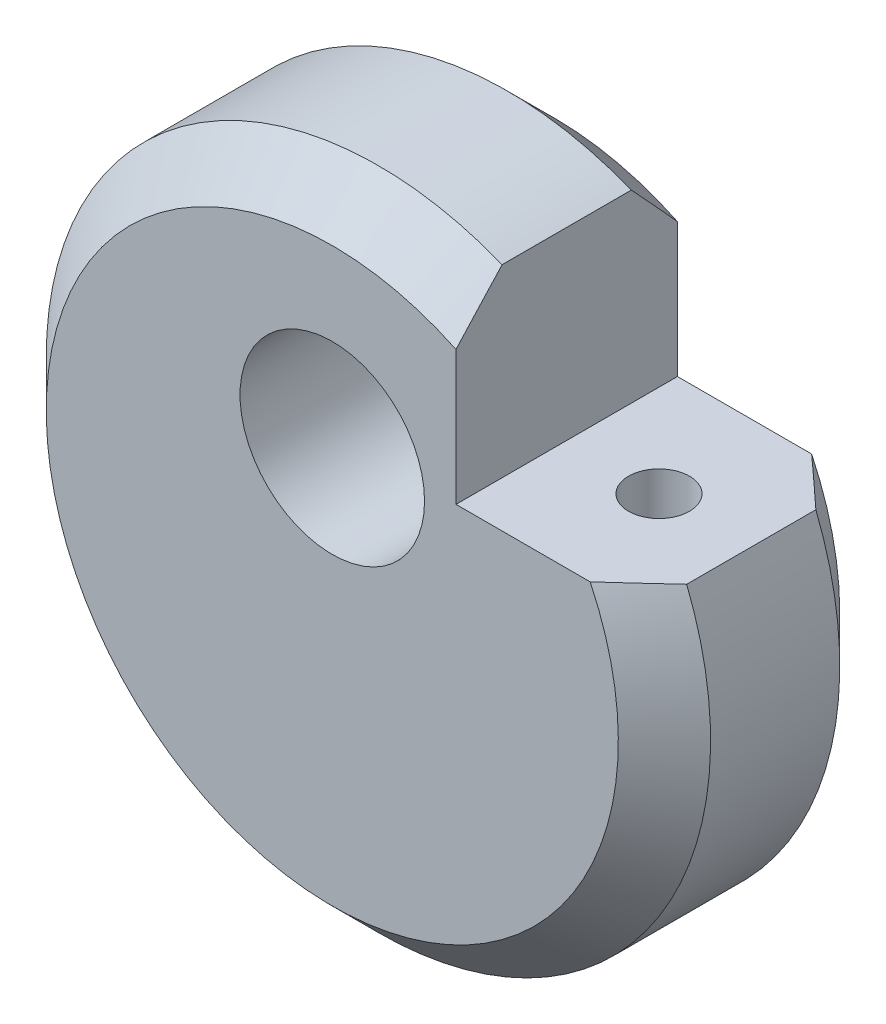
ISO-10303-21;
HEADER;
FILE_DESCRIPTION(('STEP AP214'),'2;1');
FILE_NAME('part.step','',(''),(''),'','','');
FILE_SCHEMA(('AUTOMOTIVE_DESIGN { 1 0 10303 214 1 1 1 1 }'));
ENDSEC;
DATA;
#1=APPLICATION_CONTEXT('core data for automotive mechanical design processes');
#2=APPLICATION_PROTOCOL_DEFINITION('international standard','automotive_design',2000,#1);
#3=PRODUCT_CONTEXT('',#1,'mechanical');
#4=PRODUCT('Part','Part','',(#3));
#5=PRODUCT_RELATED_PRODUCT_CATEGORY('part','',(#4));
#6=PRODUCT_DEFINITION_FORMATION('','',#4);
#7=PRODUCT_DEFINITION_CONTEXT('part definition',#1,'design');
#8=PRODUCT_DEFINITION('design','',#6,#7);
#9=PRODUCT_DEFINITION_SHAPE('','',#8);
#10=(LENGTH_UNIT() NAMED_UNIT(*) SI_UNIT(.MILLI.,.METRE.));
#11=(NAMED_UNIT(*) PLANE_ANGLE_UNIT() SI_UNIT($,.RADIAN.));
#12=(NAMED_UNIT(*) SI_UNIT($,.STERADIAN.) SOLID_ANGLE_UNIT());
#13=UNCERTAINTY_MEASURE_WITH_UNIT(LENGTH_MEASURE(1.E-05),#10,'distance_accuracy_value','');
#14=(GEOMETRIC_REPRESENTATION_CONTEXT(3) GLOBAL_UNCERTAINTY_ASSIGNED_CONTEXT((#13)) GLOBAL_UNIT_ASSIGNED_CONTEXT((#10,
#11,#12)) REPRESENTATION_CONTEXT('',''));
#15=CARTESIAN_POINT('',(0.,0.,0.));
#16=DIRECTION('',(0.,0.,1.));
#17=DIRECTION('',(1.,0.,0.));
#18=AXIS2_PLACEMENT_3D('',#15,#16,#17);
#19=CARTESIAN_POINT('',(0.,0.,-12.));
#20=DIRECTION('',(0.,0.,1.));
#21=DIRECTION('',(1.,0.,0.));
#22=AXIS2_PLACEMENT_3D('',#19,#20,#21);
#23=CYLINDRICAL_SURFACE('',#22,18.);
#24=DIRECTION('',(0.,0.,1.));
#25=VECTOR('',#24,1.);
#26=CARTESIAN_POINT('',(6.70469991071962,16.7046999107196,-17.));
#27=LINE('',#26,#25);
#28=CARTESIAN_POINT('',(6.70469991071962,16.7046999107196,-9.5));
#29=VERTEX_POINT('',#28);
#30=CARTESIAN_POINT('',(6.70469991071962,16.7046999107196,-2.50000000000001));
#31=VERTEX_POINT('',#30);
#32=EDGE_CURVE('E131',#29,#31,#27,.T.);
#33=ORIENTED_EDGE('',*,*,#32,.F.);
#34=CARTESIAN_POINT('',(0.,0.,-9.5));
#35=DIRECTION('',(0.,0.,1.));
#36=DIRECTION('',(1.,0.,0.));
#37=AXIS2_PLACEMENT_3D('',#34,#35,#36);
#38=CIRCLE('',#37,18.);
#39=CARTESIAN_POINT('',(16.7046999107196,6.70469991071962,-9.5));
#40=VERTEX_POINT('',#39);
#41=EDGE_CURVE('E172',#29,#40,#38,.T.);
#42=ORIENTED_EDGE('',*,*,#41,.T.);
#43=DIRECTION('',(0.,0.,1.));
#44=VECTOR('',#43,1.);
#45=CARTESIAN_POINT('',(16.7046999107196,6.70469991071962,-17.));
#46=LINE('',#45,#44);
#47=CARTESIAN_POINT('',(16.7046999107196,6.70469991071962,-2.50000000000001));
#48=VERTEX_POINT('',#47);
#49=EDGE_CURVE('E129',#40,#48,#46,.T.);
#50=ORIENTED_EDGE('',*,*,#49,.T.);
#51=CARTESIAN_POINT('',(0.,0.,-2.50000000000001));
#52=DIRECTION('',(0.,0.,1.));
#53=DIRECTION('',(1.,0.,0.));
#54=AXIS2_PLACEMENT_3D('',#51,#52,#53);
#55=CIRCLE('',#54,18.);
#56=EDGE_CURVE('E151',#48,#31,#55,.F.);
#57=ORIENTED_EDGE('',*,*,#56,.T.);
#58=EDGE_LOOP('',(#33,#42,#50,#57));
#59=FACE_BOUND('',#58,.T.);
#60=ADVANCED_FACE('F49',(#59),#23,.T.);
#61=CARTESIAN_POINT('',(0.,0.,-12.));
#62=DIRECTION('',(0.,0.,1.));
#63=DIRECTION('',(1.,0.,0.));
#64=AXIS2_PLACEMENT_3D('',#61,#62,#63);
#65=PLANE('',#64);
#66=CARTESIAN_POINT('',(0.,6.,-12.));
#67=DIRECTION('',(0.,0.,1.));
#68=DIRECTION('',(1.,0.,0.));
#69=AXIS2_PLACEMENT_3D('',#66,#67,#68);
#70=CIRCLE('',#69,5.);
#71=CARTESIAN_POINT('',(5.,6.,-12.));
#72=VERTEX_POINT('',#71);
#73=EDGE_CURVE('E117',#72,#72,#70,.T.);
#74=ORIENTED_EDGE('',*,*,#73,.T.);
#75=EDGE_LOOP('',(#74));
#76=FACE_BOUND('',#75,.T.);
#77=DIRECTION('',(-1.,0.,0.));
#78=VECTOR('',#77,1.);
#79=CARTESIAN_POINT('',(0.,6.70469991071962,-12.));
#80=LINE('',#79,#78);
#81=CARTESIAN_POINT('',(13.9748702715695,6.70469991071962,-12.));
#82=VERTEX_POINT('',#81);
#83=CARTESIAN_POINT('',(6.70469991071962,6.70469991071962,-12.));
#84=VERTEX_POINT('',#83);
#85=EDGE_CURVE('E138',#82,#84,#80,.T.);
#86=ORIENTED_EDGE('',*,*,#85,.F.);
#87=CARTESIAN_POINT('',(0.,0.,-12.));
#88=DIRECTION('',(0.,0.,1.));
#89=DIRECTION('',(1.,0.,0.));
#90=AXIS2_PLACEMENT_3D('',#87,#88,#89);
#91=CIRCLE('',#90,15.5);
#92=CARTESIAN_POINT('',(6.70469991071962,13.9748702715695,-12.));
#93=VERTEX_POINT('',#92);
#94=EDGE_CURVE('E64',#82,#93,#91,.F.);
#95=ORIENTED_EDGE('',*,*,#94,.T.);
#96=DIRECTION('',(0.,1.,0.));
#97=VECTOR('',#96,1.);
#98=CARTESIAN_POINT('',(6.70469991071962,0.,-12.));
#99=LINE('',#98,#97);
#100=EDGE_CURVE('E136',#84,#93,#99,.T.);
#101=ORIENTED_EDGE('',*,*,#100,.F.);
#102=EDGE_LOOP('',(#86,#95,#101));
#103=FACE_BOUND('',#102,.T.);
#104=ADVANCED_FACE('F188',(#76,#103),#65,.F.);
#105=CARTESIAN_POINT('',(0.,0.,0.));
#106=DIRECTION('',(0.,0.,1.));
#107=DIRECTION('',(1.,0.,0.));
#108=AXIS2_PLACEMENT_3D('',#105,#106,#107);
#109=PLANE('',#108);
#110=CARTESIAN_POINT('',(0.,6.,0.));
#111=DIRECTION('',(0.,0.,1.));
#112=DIRECTION('',(1.,0.,0.));
#113=AXIS2_PLACEMENT_3D('',#110,#111,#112);
#114=CIRCLE('',#113,5.);
#115=CARTESIAN_POINT('',(5.,6.,0.));
#116=VERTEX_POINT('',#115);
#117=EDGE_CURVE('E113',#116,#116,#114,.T.);
#118=ORIENTED_EDGE('',*,*,#117,.F.);
#119=EDGE_LOOP('',(#118));
#120=FACE_BOUND('',#119,.T.);
#121=DIRECTION('',(0.,1.,0.));
#122=VECTOR('',#121,1.);
#123=CARTESIAN_POINT('',(6.70469991071962,6.70469991071962,0.));
#124=LINE('',#123,#122);
#125=CARTESIAN_POINT('',(6.70469991071962,6.70469991071962,0.));
#126=VERTEX_POINT('',#125);
#127=CARTESIAN_POINT('',(6.70469991071962,13.9748702715695,0.));
#128=VERTEX_POINT('',#127);
#129=EDGE_CURVE('E126',#126,#128,#124,.T.);
#130=ORIENTED_EDGE('',*,*,#129,.T.);
#131=CARTESIAN_POINT('',(0.,0.,0.));
#132=DIRECTION('',(0.,0.,1.));
#133=DIRECTION('',(1.,0.,0.));
#134=AXIS2_PLACEMENT_3D('',#131,#132,#133);
#135=CIRCLE('',#134,15.5);
#136=CARTESIAN_POINT('',(13.9748702715695,6.70469991071962,0.));
#137=VERTEX_POINT('',#136);
#138=EDGE_CURVE('E140',#128,#137,#135,.T.);
#139=ORIENTED_EDGE('',*,*,#138,.T.);
#140=DIRECTION('',(-1.,0.,0.));
#141=VECTOR('',#140,1.);
#142=CARTESIAN_POINT('',(16.7046999107196,6.70469991071962,0.));
#143=LINE('',#142,#141);
#144=EDGE_CURVE('E124',#137,#126,#143,.T.);
#145=ORIENTED_EDGE('',*,*,#144,.T.);
#146=EDGE_LOOP('',(#130,#139,#145));
#147=FACE_BOUND('',#146,.T.);
#148=ADVANCED_FACE('F193',(#120,#147),#109,.T.);
#149=CARTESIAN_POINT('',(16.7046999107196,6.70469991071962,-17.));
#150=DIRECTION('',(0.,1.,0.));
#151=DIRECTION('',(-1.,0.,0.));
#152=AXIS2_PLACEMENT_3D('',#149,#150,#151);
#153=PLANE('',#152);
#154=CARTESIAN_POINT('',(11.7046999107196,6.70469991071962,-6.));
#155=DIRECTION('',(0.,1.,0.));
#156=DIRECTION('',(0.,0.,1.));
#157=AXIS2_PLACEMENT_3D('',#154,#155,#156);
#158=CIRCLE('',#157,1.64999999999999);
#159=CARTESIAN_POINT('',(11.7046999107196,6.70469991071962,-4.35000000000001));
#160=VERTEX_POINT('',#159);
#161=EDGE_CURVE('E114',#160,#160,#158,.T.);
#162=ORIENTED_EDGE('',*,*,#161,.F.);
#163=EDGE_LOOP('',(#162));
#164=FACE_BOUND('',#163,.T.);
#165=ORIENTED_EDGE('',*,*,#49,.F.);
#166=CARTESIAN_POINT('',(16.7046999107196,6.70469991071962,-9.5));
#167=CARTESIAN_POINT('',(16.4785916452729,6.70469991071962,-9.70983342483472));
#168=CARTESIAN_POINT('',(16.2521921968646,6.70469991071962,-9.91935360613671));
#169=CARTESIAN_POINT('',(15.7987361529174,6.70469991071962,-10.3376757142473));
#170=CARTESIAN_POINT('',(15.5716795658272,6.70469991071962,-10.5464776502156));
#171=CARTESIAN_POINT('',(15.116828068179,6.70469991071962,-10.9632774361735));
#172=CARTESIAN_POINT('',(14.8890331556405,6.70469991071962,-11.1712752840029));
#173=CARTESIAN_POINT('',(14.4326045849547,6.70469991071962,-11.5863544037917));
#174=CARTESIAN_POINT('',(14.2039709160979,6.70469991071962,-11.7934356639728));
#175=CARTESIAN_POINT('',(13.9748702715695,6.70469991071962,-12.));
#176=B_SPLINE_CURVE_WITH_KNOTS('',3,(#166,#167,#168,#169,#170,#171,#172,#173,#174,#175),
.UNSPECIFIED.,.F.,.F.,(4,2,2,2,4),(0.,0.925416401947777,1.85082095810226,2.77622799844502,
3.70164689595234),.UNSPECIFIED.);
#177=EDGE_CURVE('E78',#40,#82,#176,.T.);
#178=ORIENTED_EDGE('',*,*,#177,.T.);
#179=ORIENTED_EDGE('',*,*,#85,.T.);
#180=DIRECTION('',(0.,0.,1.));
#181=VECTOR('',#180,1.);
#182=CARTESIAN_POINT('',(6.70469991071962,6.70469991071962,-17.));
#183=LINE('',#182,#181);
#184=EDGE_CURVE('E133',#84,#126,#183,.T.);
#185=ORIENTED_EDGE('',*,*,#184,.T.);
#186=ORIENTED_EDGE('',*,*,#144,.F.);
#187=CARTESIAN_POINT('',(13.9748702715695,6.70469991071962,0.));
#188=CARTESIAN_POINT('',(14.2039709160979,6.70469991071962,-0.20656433602717));
#189=CARTESIAN_POINT('',(14.4326045849547,6.70469991071962,-0.413645596208294));
#190=CARTESIAN_POINT('',(14.8890331556405,6.70469991071962,-0.828724715997059));
#191=CARTESIAN_POINT('',(15.116828068179,6.70469991071962,-1.03672256382654));
#192=CARTESIAN_POINT('',(15.5716795658273,6.70469991071962,-1.45352234978437));
#193=CARTESIAN_POINT('',(15.7987361529174,6.70469991071962,-1.66232428575269));
#194=CARTESIAN_POINT('',(16.2521921968646,6.70469991071962,-2.08064639386331));
#195=CARTESIAN_POINT('',(16.4785916452729,6.70469991071962,-2.29016657516529));
#196=CARTESIAN_POINT('',(16.7046999107196,6.70469991071962,-2.50000000000001));
#197=B_SPLINE_CURVE_WITH_KNOTS('',3,(#187,#188,#189,#190,#191,#192,#193,#194,#195,#196),
.UNSPECIFIED.,.F.,.F.,(4,2,2,2,4),(0.,0.925418897507317,1.85082593785007,2.77623049400456,
3.70164689595234),.UNSPECIFIED.);
#198=EDGE_CURVE('E143',#137,#48,#197,.T.);
#199=ORIENTED_EDGE('',*,*,#198,.T.);
#200=EDGE_LOOP('',(#165,#178,#179,#185,#186,#199));
#201=FACE_BOUND('',#200,.T.);
#202=ADVANCED_FACE('F153',(#164,#201),#153,.T.);
#203=CARTESIAN_POINT('',(6.70469991071962,6.70469991071962,-17.));
#204=DIRECTION('',(1.,0.,0.));
#205=DIRECTION('',(0.,0.,-1.));
#206=AXIS2_PLACEMENT_3D('',#203,#204,#205);
#207=PLANE('',#206);
#208=ORIENTED_EDGE('',*,*,#100,.T.);
#209=CARTESIAN_POINT('',(6.70469991071962,13.9748702715695,-12.));
#210=CARTESIAN_POINT('',(6.70469991071962,14.2039709160979,-11.7934356639728));
#211=CARTESIAN_POINT('',(6.70469991071962,14.4326045849547,-11.5863544037917));
#212=CARTESIAN_POINT('',(6.70469991071962,14.8890331556405,-11.1712752840029));
#213=CARTESIAN_POINT('',(6.70469991071962,15.116828068179,-10.9632774361735));
#214=CARTESIAN_POINT('',(6.70469991071962,15.5716795658272,-10.5464776502156));
#215=CARTESIAN_POINT('',(6.70469991071962,15.7987361529174,-10.3376757142473));
#216=CARTESIAN_POINT('',(6.70469991071962,16.2521921968646,-9.91935360613671));
#217=CARTESIAN_POINT('',(6.70469991071962,16.4785916452729,-9.70983342483472));
#218=CARTESIAN_POINT('',(6.70469991071962,16.7046999107196,-9.5));
#219=B_SPLINE_CURVE_WITH_KNOTS('',3,(#209,#210,#211,#212,#213,#214,#215,#216,#217,#218),
.UNSPECIFIED.,.F.,.F.,(4,2,2,2,4),(0.,0.925418897507315,1.85082593785007,2.77623049400456,
3.70164689595234),.UNSPECIFIED.);
#220=EDGE_CURVE('E11',#93,#29,#219,.T.);
#221=ORIENTED_EDGE('',*,*,#220,.T.);
#222=ORIENTED_EDGE('',*,*,#32,.T.);
#223=CARTESIAN_POINT('',(6.70469991071962,16.7046999107196,-2.50000000000001));
#224=CARTESIAN_POINT('',(6.70469991071962,16.4785916452729,-2.29016657516529));
#225=CARTESIAN_POINT('',(6.70469991071962,16.2521921968646,-2.08064639386331));
#226=CARTESIAN_POINT('',(6.70469991071962,15.7987361529174,-1.66232428575269));
#227=CARTESIAN_POINT('',(6.70469991071962,15.5716795658273,-1.45352234978436));
#228=CARTESIAN_POINT('',(6.70469991071962,15.116828068179,-1.03672256382654));
#229=CARTESIAN_POINT('',(6.70469991071962,14.8890331556405,-0.828724715997059));
#230=CARTESIAN_POINT('',(6.70469991071962,14.4326045849547,-0.413645596208294));
#231=CARTESIAN_POINT('',(6.70469991071962,14.2039709160979,-0.20656433602717));
#232=CARTESIAN_POINT('',(6.70469991071962,13.9748702715695,0.));
#233=B_SPLINE_CURVE_WITH_KNOTS('',3,(#223,#224,#225,#226,#227,#228,#229,#230,#231,#232),
.UNSPECIFIED.,.F.,.F.,(4,2,2,2,4),(0.,0.925416401947774,1.85082095810226,2.77622799844502,
3.70164689595233),.UNSPECIFIED.);
#234=EDGE_CURVE('E166',#31,#128,#233,.T.);
#235=ORIENTED_EDGE('',*,*,#234,.T.);
#236=ORIENTED_EDGE('',*,*,#129,.F.);
#237=ORIENTED_EDGE('',*,*,#184,.F.);
#238=EDGE_LOOP('',(#208,#221,#222,#235,#236,#237));
#239=FACE_BOUND('',#238,.T.);
#240=ADVANCED_FACE('F174',(#239),#207,.T.);
#241=CARTESIAN_POINT('',(0.,6.,-22.));
#242=DIRECTION('',(0.,0.,1.));
#243=DIRECTION('',(1.,0.,0.));
#244=AXIS2_PLACEMENT_3D('',#241,#242,#243);
#245=CYLINDRICAL_SURFACE('',#244,5.);
#246=ORIENTED_EDGE('',*,*,#117,.T.);
#247=EDGE_LOOP('',(#246));
#248=FACE_BOUND('',#247,.T.);
#249=ORIENTED_EDGE('',*,*,#73,.F.);
#250=EDGE_LOOP('',(#249));
#251=FACE_BOUND('',#250,.T.);
#252=ADVANCED_FACE('F107',(#248,#251),#245,.F.);
#253=CARTESIAN_POINT('',(11.7046999107196,-7.29530008928038,-6.));
#254=DIRECTION('',(0.,1.,0.));
#255=DIRECTION('',(0.,0.,1.));
#256=AXIS2_PLACEMENT_3D('',#253,#254,#255);
#257=CONICAL_SURFACE('',#256,1.65,1.02974425867665);
#258=CARTESIAN_POINT('',(11.7046999107196,-8.28672011067586,-6.));
#259=VERTEX_POINT('',#258);
#260=VERTEX_LOOP('',#259);
#261=FACE_BOUND('',#260,.T.);
#262=CARTESIAN_POINT('',(11.7046999107196,-7.29530008928038,-6.));
#263=DIRECTION('',(0.,1.,0.));
#264=DIRECTION('',(0.,0.,1.));
#265=AXIS2_PLACEMENT_3D('',#262,#263,#264);
#266=CIRCLE('',#265,1.65);
#267=CARTESIAN_POINT('',(11.7046999107196,-7.29530008928038,-4.35));
#268=VERTEX_POINT('',#267);
#269=EDGE_CURVE('E111',#268,#268,#266,.T.);
#270=ORIENTED_EDGE('',*,*,#269,.T.);
#271=EDGE_LOOP('',(#270));
#272=FACE_BOUND('',#271,.T.);
#273=ADVANCED_FACE('F103',(#261,#272),#257,.F.);
#274=CARTESIAN_POINT('',(11.7046999107196,6.70469991071962,-6.));
#275=DIRECTION('',(0.,1.,0.));
#276=DIRECTION('',(0.,0.,1.));
#277=AXIS2_PLACEMENT_3D('',#274,#275,#276);
#278=CYLINDRICAL_SURFACE('',#277,1.64999999999999);
#279=ORIENTED_EDGE('',*,*,#269,.F.);
#280=EDGE_LOOP('',(#279));
#281=FACE_BOUND('',#280,.T.);
#282=ORIENTED_EDGE('',*,*,#161,.T.);
#283=EDGE_LOOP('',(#282));
#284=FACE_BOUND('',#283,.T.);
#285=ADVANCED_FACE('F106',(#281,#284),#278,.F.);
#286=CARTESIAN_POINT('',(0.,0.,0.));
#287=DIRECTION('',(0.,0.,-1.));
#288=DIRECTION('',(-1.,0.,0.));
#289=AXIS2_PLACEMENT_3D('',#286,#287,#288);
#290=CONICAL_SURFACE('',#289,15.5,0.785398163397445);
#291=ORIENTED_EDGE('',*,*,#234,.F.);
#292=ORIENTED_EDGE('',*,*,#56,.F.);
#293=ORIENTED_EDGE('',*,*,#198,.F.);
#294=ORIENTED_EDGE('',*,*,#138,.F.);
#295=EDGE_LOOP('',(#291,#292,#293,#294));
#296=FACE_BOUND('',#295,.T.);
#297=ADVANCED_FACE('F157',(#296),#290,.T.);
#298=CARTESIAN_POINT('',(0.,0.,-9.5));
#299=DIRECTION('',(0.,0.,1.));
#300=DIRECTION('',(1.,0.,0.));
#301=AXIS2_PLACEMENT_3D('',#298,#299,#300);
#302=CONICAL_SURFACE('',#301,18.,0.785398163397449);
#303=ORIENTED_EDGE('',*,*,#220,.F.);
#304=ORIENTED_EDGE('',*,*,#94,.F.);
#305=ORIENTED_EDGE('',*,*,#177,.F.);
#306=ORIENTED_EDGE('',*,*,#41,.F.);
#307=EDGE_LOOP('',(#303,#304,#305,#306));
#308=FACE_BOUND('',#307,.T.);
#309=ADVANCED_FACE('F52',(#308),#302,.T.);
#310=CLOSED_SHELL('',(#60,#104,#148,#202,#240,#252,#273,#285,#297,#309));
#311=MANIFOLD_SOLID_BREP('B2',#310);
#312=ADVANCED_BREP_SHAPE_REPRESENTATION('',(#18,#311),#14);
#313=SHAPE_DEFINITION_REPRESENTATION(#9,#312);
ENDSEC;
END-ISO-10303-21;
